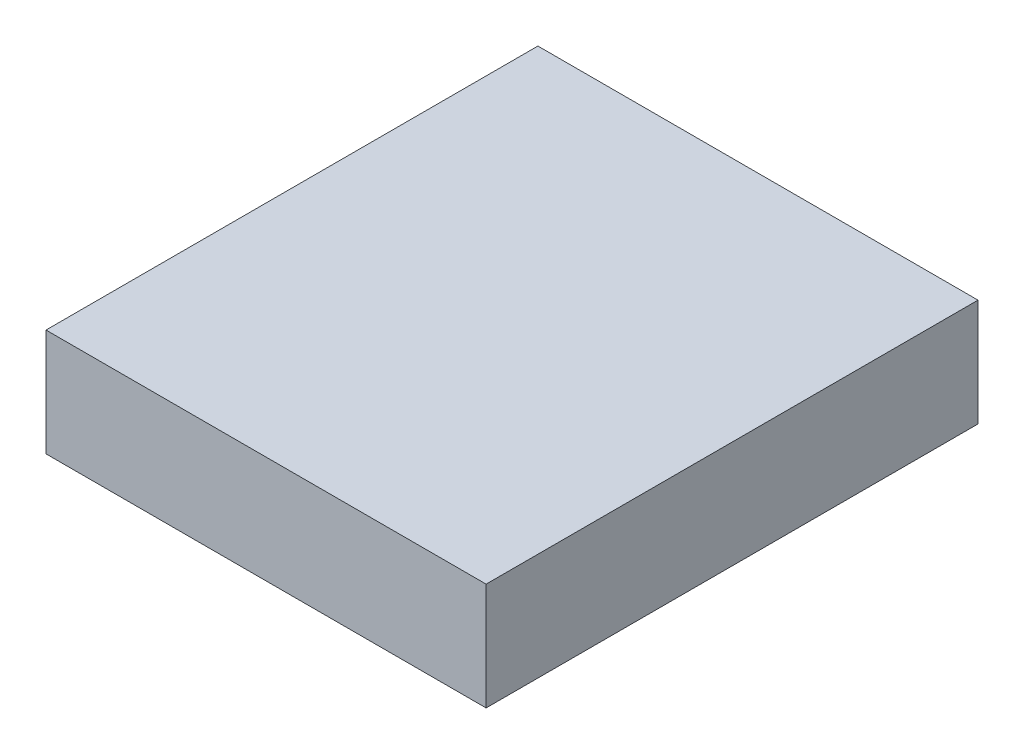
ISO-10303-21;
HEADER;
FILE_DESCRIPTION(('STEP AP214'),'2;1');
FILE_NAME('part.step','',(''),(''),'','','');
FILE_SCHEMA(('AUTOMOTIVE_DESIGN { 1 0 10303 214 1 1 1 1 }'));
ENDSEC;
DATA;
#1=APPLICATION_CONTEXT('core data for automotive mechanical design processes');
#2=APPLICATION_PROTOCOL_DEFINITION('international standard','automotive_design',2000,#1);
#3=PRODUCT_CONTEXT('',#1,'mechanical');
#4=PRODUCT('Part','Part','',(#3));
#5=PRODUCT_RELATED_PRODUCT_CATEGORY('part','',(#4));
#6=PRODUCT_DEFINITION_FORMATION('','',#4);
#7=PRODUCT_DEFINITION_CONTEXT('part definition',#1,'design');
#8=PRODUCT_DEFINITION('design','',#6,#7);
#9=PRODUCT_DEFINITION_SHAPE('','',#8);
#10=(LENGTH_UNIT() NAMED_UNIT(*) SI_UNIT(.MILLI.,.METRE.));
#11=(NAMED_UNIT(*) PLANE_ANGLE_UNIT() SI_UNIT($,.RADIAN.));
#12=(NAMED_UNIT(*) SI_UNIT($,.STERADIAN.) SOLID_ANGLE_UNIT());
#13=UNCERTAINTY_MEASURE_WITH_UNIT(LENGTH_MEASURE(1.E-05),#10,'distance_accuracy_value','');
#14=(GEOMETRIC_REPRESENTATION_CONTEXT(3) GLOBAL_UNCERTAINTY_ASSIGNED_CONTEXT((#13)) GLOBAL_UNIT_ASSIGNED_CONTEXT((#10,
#11,#12)) REPRESENTATION_CONTEXT('',''));
#15=CARTESIAN_POINT('',(0.,0.,0.));
#16=DIRECTION('',(0.,0.,1.));
#17=DIRECTION('',(1.,0.,0.));
#18=AXIS2_PLACEMENT_3D('',#15,#16,#17);
#19=CARTESIAN_POINT('',(0.,7.25,-33.25));
#20=DIRECTION('',(1.,0.,0.));
#21=DIRECTION('',(0.,0.,-1.));
#22=AXIS2_PLACEMENT_3D('',#19,#20,#21);
#23=PLANE('',#22);
#24=DIRECTION('',(0.,0.,1.));
#25=VECTOR('',#24,1.);
#26=CARTESIAN_POINT('',(0.,0.,-33.25));
#27=LINE('',#26,#25);
#28=CARTESIAN_POINT('',(0.,0.,-33.25));
#29=VERTEX_POINT('',#28);
#30=CARTESIAN_POINT('',(0.,0.,0.));
#31=VERTEX_POINT('',#30);
#32=EDGE_CURVE('E111',#29,#31,#27,.T.);
#33=ORIENTED_EDGE('',*,*,#32,.T.);
#34=DIRECTION('',(0.,-1.,0.));
#35=VECTOR('',#34,1.);
#36=CARTESIAN_POINT('',(0.,7.25,0.));
#37=LINE('',#36,#35);
#38=CARTESIAN_POINT('',(0.,7.25,0.));
#39=VERTEX_POINT('',#38);
#40=EDGE_CURVE('E11',#39,#31,#37,.T.);
#41=ORIENTED_EDGE('',*,*,#40,.F.);
#42=DIRECTION('',(0.,0.,1.));
#43=VECTOR('',#42,1.);
#44=CARTESIAN_POINT('',(0.,7.25,-33.25));
#45=LINE('',#44,#43);
#46=CARTESIAN_POINT('',(0.,7.25,-33.25));
#47=VERTEX_POINT('',#46);
#48=EDGE_CURVE('E95',#47,#39,#45,.T.);
#49=ORIENTED_EDGE('',*,*,#48,.F.);
#50=DIRECTION('',(0.,-1.,0.));
#51=VECTOR('',#50,1.);
#52=CARTESIAN_POINT('',(0.,7.25,-33.25));
#53=LINE('',#52,#51);
#54=EDGE_CURVE('E107',#47,#29,#53,.T.);
#55=ORIENTED_EDGE('',*,*,#54,.T.);
#56=EDGE_LOOP('',(#33,#41,#49,#55));
#57=FACE_BOUND('',#56,.T.);
#58=ADVANCED_FACE('F43',(#57),#23,.F.);
#59=CARTESIAN_POINT('',(0.,7.25,0.));
#60=DIRECTION('',(0.,0.,-1.));
#61=DIRECTION('',(-1.,0.,0.));
#62=AXIS2_PLACEMENT_3D('',#59,#60,#61);
#63=PLANE('',#62);
#64=DIRECTION('',(1.,0.,0.));
#65=VECTOR('',#64,1.);
#66=CARTESIAN_POINT('',(0.,0.,0.));
#67=LINE('',#66,#65);
#68=CARTESIAN_POINT('',(29.75,0.,0.));
#69=VERTEX_POINT('',#68);
#70=EDGE_CURVE('E100',#31,#69,#67,.T.);
#71=ORIENTED_EDGE('',*,*,#70,.T.);
#72=DIRECTION('',(0.,-1.,0.));
#73=VECTOR('',#72,1.);
#74=CARTESIAN_POINT('',(29.75,7.25,0.));
#75=LINE('',#74,#73);
#76=CARTESIAN_POINT('',(29.75,7.25,0.));
#77=VERTEX_POINT('',#76);
#78=EDGE_CURVE('E52',#77,#69,#75,.T.);
#79=ORIENTED_EDGE('',*,*,#78,.F.);
#80=DIRECTION('',(1.,0.,0.));
#81=VECTOR('',#80,1.);
#82=CARTESIAN_POINT('',(0.,7.25,0.));
#83=LINE('',#82,#81);
#84=EDGE_CURVE('E90',#39,#77,#83,.T.);
#85=ORIENTED_EDGE('',*,*,#84,.F.);
#86=ORIENTED_EDGE('',*,*,#40,.T.);
#87=EDGE_LOOP('',(#71,#79,#85,#86));
#88=FACE_BOUND('',#87,.T.);
#89=ADVANCED_FACE('F99',(#88),#63,.F.);
#90=CARTESIAN_POINT('',(29.75,7.25,0.));
#91=DIRECTION('',(-1.,0.,0.));
#92=DIRECTION('',(0.,0.,1.));
#93=AXIS2_PLACEMENT_3D('',#90,#91,#92);
#94=PLANE('',#93);
#95=DIRECTION('',(0.,0.,-1.));
#96=VECTOR('',#95,1.);
#97=CARTESIAN_POINT('',(29.75,0.,0.));
#98=LINE('',#97,#96);
#99=CARTESIAN_POINT('',(29.75,0.,-33.25));
#100=VERTEX_POINT('',#99);
#101=EDGE_CURVE('E77',#69,#100,#98,.T.);
#102=ORIENTED_EDGE('',*,*,#101,.T.);
#103=DIRECTION('',(0.,-1.,0.));
#104=VECTOR('',#103,1.);
#105=CARTESIAN_POINT('',(29.75,7.25,-33.25));
#106=LINE('',#105,#104);
#107=CARTESIAN_POINT('',(29.75,7.25,-33.25));
#108=VERTEX_POINT('',#107);
#109=EDGE_CURVE('E102',#108,#100,#106,.T.);
#110=ORIENTED_EDGE('',*,*,#109,.F.);
#111=DIRECTION('',(0.,0.,-1.));
#112=VECTOR('',#111,1.);
#113=CARTESIAN_POINT('',(29.75,7.25,0.));
#114=LINE('',#113,#112);
#115=EDGE_CURVE('E93',#77,#108,#114,.T.);
#116=ORIENTED_EDGE('',*,*,#115,.F.);
#117=ORIENTED_EDGE('',*,*,#78,.T.);
#118=EDGE_LOOP('',(#102,#110,#116,#117));
#119=FACE_BOUND('',#118,.T.);
#120=ADVANCED_FACE('F103',(#119),#94,.F.);
#121=CARTESIAN_POINT('',(29.75,7.25,-33.25));
#122=DIRECTION('',(0.,0.,1.));
#123=DIRECTION('',(1.,0.,0.));
#124=AXIS2_PLACEMENT_3D('',#121,#122,#123);
#125=PLANE('',#124);
#126=DIRECTION('',(-1.,0.,0.));
#127=VECTOR('',#126,1.);
#128=CARTESIAN_POINT('',(29.75,0.,-33.25));
#129=LINE('',#128,#127);
#130=EDGE_CURVE('E83',#100,#29,#129,.T.);
#131=ORIENTED_EDGE('',*,*,#130,.T.);
#132=ORIENTED_EDGE('',*,*,#54,.F.);
#133=DIRECTION('',(-1.,0.,0.));
#134=VECTOR('',#133,1.);
#135=CARTESIAN_POINT('',(29.75,7.25,-33.25));
#136=LINE('',#135,#134);
#137=EDGE_CURVE('E60',#108,#47,#136,.T.);
#138=ORIENTED_EDGE('',*,*,#137,.F.);
#139=ORIENTED_EDGE('',*,*,#109,.T.);
#140=EDGE_LOOP('',(#131,#132,#138,#139));
#141=FACE_BOUND('',#140,.T.);
#142=ADVANCED_FACE('F124',(#141),#125,.F.);
#143=CARTESIAN_POINT('',(0.,7.25,0.));
#144=DIRECTION('',(0.,1.,0.));
#145=DIRECTION('',(0.,0.,1.));
#146=AXIS2_PLACEMENT_3D('',#143,#144,#145);
#147=PLANE('',#146);
#148=ORIENTED_EDGE('',*,*,#48,.T.);
#149=ORIENTED_EDGE('',*,*,#84,.T.);
#150=ORIENTED_EDGE('',*,*,#115,.T.);
#151=ORIENTED_EDGE('',*,*,#137,.T.);
#152=EDGE_LOOP('',(#148,#149,#150,#151));
#153=FACE_BOUND('',#152,.T.);
#154=ADVANCED_FACE('F91',(#153),#147,.T.);
#155=CARTESIAN_POINT('',(0.,0.,0.));
#156=DIRECTION('',(0.,1.,0.));
#157=DIRECTION('',(0.,0.,1.));
#158=AXIS2_PLACEMENT_3D('',#155,#156,#157);
#159=PLANE('',#158);
#160=ORIENTED_EDGE('',*,*,#32,.F.);
#161=ORIENTED_EDGE('',*,*,#130,.F.);
#162=ORIENTED_EDGE('',*,*,#101,.F.);
#163=ORIENTED_EDGE('',*,*,#70,.F.);
#164=EDGE_LOOP('',(#160,#161,#162,#163));
#165=FACE_BOUND('',#164,.T.);
#166=ADVANCED_FACE('F127',(#165),#159,.F.);
#167=CLOSED_SHELL('',(#58,#89,#120,#142,#154,#166));
#168=MANIFOLD_SOLID_BREP('B2',#167);
#169=ADVANCED_BREP_SHAPE_REPRESENTATION('',(#18,#168),#14);
#170=SHAPE_DEFINITION_REPRESENTATION(#9,#169);
ENDSEC;
END-ISO-10303-21;
